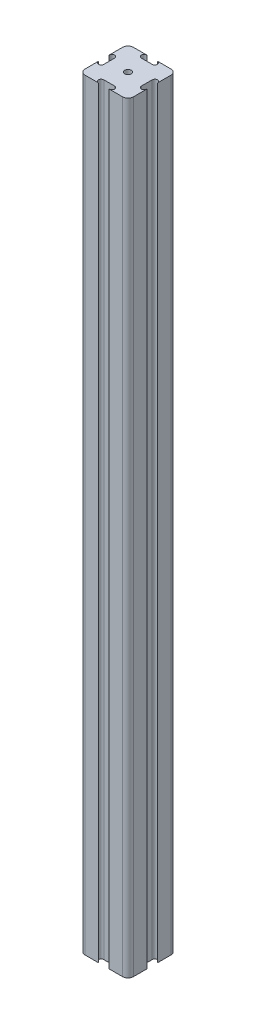
ISO-10303-21;
HEADER;
FILE_DESCRIPTION(('STEP AP214'),'2;1');
FILE_NAME('part.step','',(''),(''),'','','');
FILE_SCHEMA(('AUTOMOTIVE_DESIGN { 1 0 10303 214 1 1 1 1 }'));
ENDSEC;
DATA;
#1=APPLICATION_CONTEXT('core data for automotive mechanical design processes');
#2=APPLICATION_PROTOCOL_DEFINITION('international standard','automotive_design',2000,#1);
#3=PRODUCT_CONTEXT('',#1,'mechanical');
#4=PRODUCT('Part','Part','',(#3));
#5=PRODUCT_RELATED_PRODUCT_CATEGORY('part','',(#4));
#6=PRODUCT_DEFINITION_FORMATION('','',#4);
#7=PRODUCT_DEFINITION_CONTEXT('part definition',#1,'design');
#8=PRODUCT_DEFINITION('design','',#6,#7);
#9=PRODUCT_DEFINITION_SHAPE('','',#8);
#10=(LENGTH_UNIT() NAMED_UNIT(*) SI_UNIT(.MILLI.,.METRE.));
#11=(NAMED_UNIT(*) PLANE_ANGLE_UNIT() SI_UNIT($,.RADIAN.));
#12=(NAMED_UNIT(*) SI_UNIT($,.STERADIAN.) SOLID_ANGLE_UNIT());
#13=UNCERTAINTY_MEASURE_WITH_UNIT(LENGTH_MEASURE(1.E-05),#10,'distance_accuracy_value','');
#14=(GEOMETRIC_REPRESENTATION_CONTEXT(3) GLOBAL_UNCERTAINTY_ASSIGNED_CONTEXT((#13)) GLOBAL_UNIT_ASSIGNED_CONTEXT((#10,
#11,#12)) REPRESENTATION_CONTEXT('',''));
#15=CARTESIAN_POINT('',(0.,0.,0.));
#16=DIRECTION('',(0.,0.,1.));
#17=DIRECTION('',(1.,0.,0.));
#18=AXIS2_PLACEMENT_3D('',#15,#16,#17);
#19=CARTESIAN_POINT('',(-20.,710.,5.));
#20=DIRECTION('',(0.,-1.,0.));
#21=DIRECTION('',(0.,0.,-1.));
#22=AXIS2_PLACEMENT_3D('',#19,#20,#21);
#23=CYLINDRICAL_SURFACE('',#22,2.5);
#24=CARTESIAN_POINT('',(-20.,0.,5.));
#25=DIRECTION('',(0.,-1.,0.));
#26=DIRECTION('',(0.,0.,-1.));
#27=AXIS2_PLACEMENT_3D('',#24,#25,#26);
#28=CIRCLE('',#27,2.5);
#29=CARTESIAN_POINT('',(-17.5,0.,5.));
#30=VERTEX_POINT('',#29);
#31=CARTESIAN_POINT('',(-22.5,0.,5.));
#32=VERTEX_POINT('',#31);
#33=EDGE_CURVE('E225',#30,#32,#28,.T.);
#34=ORIENTED_EDGE('',*,*,#33,.T.);
#35=DIRECTION('',(0.,-1.,0.));
#36=VECTOR('',#35,1.);
#37=CARTESIAN_POINT('',(-22.5,710.,5.));
#38=LINE('',#37,#36);
#39=CARTESIAN_POINT('',(-22.5,710.,5.));
#40=VERTEX_POINT('',#39);
#41=EDGE_CURVE('E11',#40,#32,#38,.T.);
#42=ORIENTED_EDGE('',*,*,#41,.F.);
#43=CARTESIAN_POINT('',(-20.,710.,5.));
#44=DIRECTION('',(0.,-1.,0.));
#45=DIRECTION('',(0.,0.,-1.));
#46=AXIS2_PLACEMENT_3D('',#43,#44,#45);
#47=CIRCLE('',#46,2.5);
#48=CARTESIAN_POINT('',(-17.5,710.,5.));
#49=VERTEX_POINT('',#48);
#50=EDGE_CURVE('E290',#49,#40,#47,.T.);
#51=ORIENTED_EDGE('',*,*,#50,.F.);
#52=DIRECTION('',(0.,-1.,0.));
#53=VECTOR('',#52,1.);
#54=CARTESIAN_POINT('',(-17.5,710.,5.));
#55=LINE('',#54,#53);
#56=EDGE_CURVE('E221',#49,#30,#55,.T.);
#57=ORIENTED_EDGE('',*,*,#56,.T.);
#58=EDGE_LOOP('',(#34,#42,#51,#57));
#59=FACE_BOUND('',#58,.T.);
#60=ADVANCED_FACE('F33',(#59),#23,.F.);
#61=CARTESIAN_POINT('',(-22.5,710.,5.));
#62=DIRECTION('',(1.,0.,0.));
#63=DIRECTION('',(0.,0.,-1.));
#64=AXIS2_PLACEMENT_3D('',#61,#62,#63);
#65=PLANE('',#64);
#66=DIRECTION('',(0.,0.,1.));
#67=VECTOR('',#66,1.);
#68=CARTESIAN_POINT('',(-22.5,0.,5.));
#69=LINE('',#68,#67);
#70=CARTESIAN_POINT('',(-22.5,0.,17.4999999999999));
#71=VERTEX_POINT('',#70);
#72=EDGE_CURVE('E228',#32,#71,#69,.T.);
#73=ORIENTED_EDGE('',*,*,#72,.T.);
#74=DIRECTION('',(0.,-1.,0.));
#75=VECTOR('',#74,1.);
#76=CARTESIAN_POINT('',(-22.5,710.,17.4999999999999));
#77=LINE('',#76,#75);
#78=CARTESIAN_POINT('',(-22.5,710.,17.4999999999999));
#79=VERTEX_POINT('',#78);
#80=EDGE_CURVE('E41',#79,#71,#77,.T.);
#81=ORIENTED_EDGE('',*,*,#80,.F.);
#82=DIRECTION('',(0.,0.,1.));
#83=VECTOR('',#82,1.);
#84=CARTESIAN_POINT('',(-22.5,710.,5.));
#85=LINE('',#84,#83);
#86=EDGE_CURVE('E136',#40,#79,#85,.T.);
#87=ORIENTED_EDGE('',*,*,#86,.F.);
#88=ORIENTED_EDGE('',*,*,#41,.T.);
#89=EDGE_LOOP('',(#73,#81,#87,#88));
#90=FACE_BOUND('',#89,.T.);
#91=ADVANCED_FACE('F417',(#90),#65,.F.);
#92=CARTESIAN_POINT('',(-17.5,710.,17.5));
#93=DIRECTION('',(0.,-1.,0.));
#94=DIRECTION('',(0.,0.,-1.));
#95=AXIS2_PLACEMENT_3D('',#92,#93,#94);
#96=CYLINDRICAL_SURFACE('',#95,5.);
#97=CARTESIAN_POINT('',(-17.5,0.,17.5));
#98=DIRECTION('',(0.,1.,0.));
#99=DIRECTION('',(0.,0.,1.));
#100=AXIS2_PLACEMENT_3D('',#97,#98,#99);
#101=CIRCLE('',#100,5.);
#102=CARTESIAN_POINT('',(-17.5,0.,22.5));
#103=VERTEX_POINT('',#102);
#104=EDGE_CURVE('E231',#71,#103,#101,.T.);
#105=ORIENTED_EDGE('',*,*,#104,.T.);
#106=DIRECTION('',(0.,-1.,0.));
#107=VECTOR('',#106,1.);
#108=CARTESIAN_POINT('',(-17.5,710.,22.5));
#109=LINE('',#108,#107);
#110=CARTESIAN_POINT('',(-17.5,710.,22.5));
#111=VERTEX_POINT('',#110);
#112=EDGE_CURVE('E329',#111,#103,#109,.T.);
#113=ORIENTED_EDGE('',*,*,#112,.F.);
#114=CARTESIAN_POINT('',(-17.5,710.,17.5));
#115=DIRECTION('',(0.,1.,0.));
#116=DIRECTION('',(0.,0.,1.));
#117=AXIS2_PLACEMENT_3D('',#114,#115,#116);
#118=CIRCLE('',#117,5.);
#119=EDGE_CURVE('E336',#79,#111,#118,.T.);
#120=ORIENTED_EDGE('',*,*,#119,.F.);
#121=ORIENTED_EDGE('',*,*,#80,.T.);
#122=EDGE_LOOP('',(#105,#113,#120,#121));
#123=FACE_BOUND('',#122,.T.);
#124=ADVANCED_FACE('F334',(#123),#96,.T.);
#125=CARTESIAN_POINT('',(-4.99999999999998,710.,22.5));
#126=DIRECTION('',(0.,0.,1.));
#127=DIRECTION('',(1.,0.,0.));
#128=AXIS2_PLACEMENT_3D('',#125,#126,#127);
#129=PLANE('',#128);
#130=DIRECTION('',(-1.,0.,0.));
#131=VECTOR('',#130,1.);
#132=CARTESIAN_POINT('',(-4.99999999999998,0.,22.5));
#133=LINE('',#132,#131);
#134=CARTESIAN_POINT('',(-4.99999999999998,0.,22.5));
#135=VERTEX_POINT('',#134);
#136=EDGE_CURVE('E234',#135,#103,#133,.T.);
#137=ORIENTED_EDGE('',*,*,#136,.F.);
#138=DIRECTION('',(0.,-1.,0.));
#139=VECTOR('',#138,1.);
#140=CARTESIAN_POINT('',(-4.99999999999998,710.,22.5));
#141=LINE('',#140,#139);
#142=CARTESIAN_POINT('',(-4.99999999999998,710.,22.5));
#143=VERTEX_POINT('',#142);
#144=EDGE_CURVE('E327',#143,#135,#141,.T.);
#145=ORIENTED_EDGE('',*,*,#144,.F.);
#146=DIRECTION('',(-1.,0.,0.));
#147=VECTOR('',#146,1.);
#148=CARTESIAN_POINT('',(-4.99999999999998,710.,22.5));
#149=LINE('',#148,#147);
#150=EDGE_CURVE('E347',#143,#111,#149,.T.);
#151=ORIENTED_EDGE('',*,*,#150,.T.);
#152=ORIENTED_EDGE('',*,*,#112,.T.);
#153=EDGE_LOOP('',(#137,#145,#151,#152));
#154=FACE_BOUND('',#153,.T.);
#155=ADVANCED_FACE('F344',(#154),#129,.T.);
#156=CARTESIAN_POINT('',(-5.,710.,20.));
#157=DIRECTION('',(0.,-1.,0.));
#158=DIRECTION('',(0.,0.,-1.));
#159=AXIS2_PLACEMENT_3D('',#156,#157,#158);
#160=CYLINDRICAL_SURFACE('',#159,2.5);
#161=CARTESIAN_POINT('',(-5.,0.,20.));
#162=DIRECTION('',(0.,1.,0.));
#163=DIRECTION('',(0.,0.,1.));
#164=AXIS2_PLACEMENT_3D('',#161,#162,#163);
#165=CIRCLE('',#164,2.5);
#166=CARTESIAN_POINT('',(-4.99999999999998,0.,17.5));
#167=VERTEX_POINT('',#166);
#168=EDGE_CURVE('E237',#167,#135,#165,.T.);
#169=ORIENTED_EDGE('',*,*,#168,.F.);
#170=DIRECTION('',(0.,-1.,0.));
#171=VECTOR('',#170,1.);
#172=CARTESIAN_POINT('',(-4.99999999999998,710.,17.5));
#173=LINE('',#172,#171);
#174=CARTESIAN_POINT('',(-4.99999999999998,710.,17.5));
#175=VERTEX_POINT('',#174);
#176=EDGE_CURVE('E325',#175,#167,#173,.T.);
#177=ORIENTED_EDGE('',*,*,#176,.F.);
#178=CARTESIAN_POINT('',(-5.,710.,20.));
#179=DIRECTION('',(0.,1.,0.));
#180=DIRECTION('',(0.,0.,1.));
#181=AXIS2_PLACEMENT_3D('',#178,#179,#180);
#182=CIRCLE('',#181,2.5);
#183=EDGE_CURVE('E350',#175,#143,#182,.T.);
#184=ORIENTED_EDGE('',*,*,#183,.T.);
#185=ORIENTED_EDGE('',*,*,#144,.T.);
#186=EDGE_LOOP('',(#169,#177,#184,#185));
#187=FACE_BOUND('',#186,.T.);
#188=ADVANCED_FACE('F624',(#187),#160,.F.);
#189=CARTESIAN_POINT('',(-4.99999999999998,710.,17.5));
#190=DIRECTION('',(0.,0.,-1.));
#191=DIRECTION('',(-1.,0.,0.));
#192=AXIS2_PLACEMENT_3D('',#189,#190,#191);
#193=PLANE('',#192);
#194=DIRECTION('',(1.,0.,0.));
#195=VECTOR('',#194,1.);
#196=CARTESIAN_POINT('',(-4.99999999999998,0.,17.5));
#197=LINE('',#196,#195);
#198=CARTESIAN_POINT('',(5.00000000000002,0.,17.5));
#199=VERTEX_POINT('',#198);
#200=EDGE_CURVE('E240',#167,#199,#197,.T.);
#201=ORIENTED_EDGE('',*,*,#200,.T.);
#202=DIRECTION('',(0.,-1.,0.));
#203=VECTOR('',#202,1.);
#204=CARTESIAN_POINT('',(5.00000000000002,710.,17.5));
#205=LINE('',#204,#203);
#206=CARTESIAN_POINT('',(5.00000000000002,710.,17.5));
#207=VERTEX_POINT('',#206);
#208=EDGE_CURVE('E323',#207,#199,#205,.T.);
#209=ORIENTED_EDGE('',*,*,#208,.F.);
#210=DIRECTION('',(1.,0.,0.));
#211=VECTOR('',#210,1.);
#212=CARTESIAN_POINT('',(-4.99999999999998,710.,17.5));
#213=LINE('',#212,#211);
#214=EDGE_CURVE('E352',#175,#207,#213,.T.);
#215=ORIENTED_EDGE('',*,*,#214,.F.);
#216=ORIENTED_EDGE('',*,*,#176,.T.);
#217=EDGE_LOOP('',(#201,#209,#215,#216));
#218=FACE_BOUND('',#217,.T.);
#219=ADVANCED_FACE('F614',(#218),#193,.F.);
#220=CARTESIAN_POINT('',(4.99999999999996,710.,20.));
#221=DIRECTION('',(0.,-1.,0.));
#222=DIRECTION('',(0.,0.,-1.));
#223=AXIS2_PLACEMENT_3D('',#220,#221,#222);
#224=CYLINDRICAL_SURFACE('',#223,2.50000000000001);
#225=CARTESIAN_POINT('',(4.99999999999996,0.,20.));
#226=DIRECTION('',(0.,1.,0.));
#227=DIRECTION('',(0.,0.,1.));
#228=AXIS2_PLACEMENT_3D('',#225,#226,#227);
#229=CIRCLE('',#228,2.50000000000001);
#230=CARTESIAN_POINT('',(4.99999999999996,0.,22.5));
#231=VERTEX_POINT('',#230);
#232=EDGE_CURVE('E243',#231,#199,#229,.T.);
#233=ORIENTED_EDGE('',*,*,#232,.F.);
#234=DIRECTION('',(0.,-1.,0.));
#235=VECTOR('',#234,1.);
#236=CARTESIAN_POINT('',(4.99999999999996,710.,22.5));
#237=LINE('',#236,#235);
#238=CARTESIAN_POINT('',(4.99999999999996,710.,22.5));
#239=VERTEX_POINT('',#238);
#240=EDGE_CURVE('E321',#239,#231,#237,.T.);
#241=ORIENTED_EDGE('',*,*,#240,.F.);
#242=CARTESIAN_POINT('',(4.99999999999996,710.,20.));
#243=DIRECTION('',(0.,1.,0.));
#244=DIRECTION('',(0.,0.,1.));
#245=AXIS2_PLACEMENT_3D('',#242,#243,#244);
#246=CIRCLE('',#245,2.50000000000001);
#247=EDGE_CURVE('E358',#239,#207,#246,.T.);
#248=ORIENTED_EDGE('',*,*,#247,.T.);
#249=ORIENTED_EDGE('',*,*,#208,.T.);
#250=EDGE_LOOP('',(#233,#241,#248,#249));
#251=FACE_BOUND('',#250,.T.);
#252=ADVANCED_FACE('F604',(#251),#224,.F.);
#253=CARTESIAN_POINT('',(4.99999999999996,710.,22.5));
#254=DIRECTION('',(0.,0.,-1.));
#255=DIRECTION('',(-1.,0.,0.));
#256=AXIS2_PLACEMENT_3D('',#253,#254,#255);
#257=PLANE('',#256);
#258=DIRECTION('',(1.,0.,0.));
#259=VECTOR('',#258,1.);
#260=CARTESIAN_POINT('',(4.99999999999996,0.,22.5));
#261=LINE('',#260,#259);
#262=CARTESIAN_POINT('',(17.5,0.,22.5));
#263=VERTEX_POINT('',#262);
#264=EDGE_CURVE('E246',#231,#263,#261,.T.);
#265=ORIENTED_EDGE('',*,*,#264,.T.);
#266=DIRECTION('',(0.,-1.,0.));
#267=VECTOR('',#266,1.);
#268=CARTESIAN_POINT('',(17.5,710.,22.5));
#269=LINE('',#268,#267);
#270=CARTESIAN_POINT('',(17.5,710.,22.5));
#271=VERTEX_POINT('',#270);
#272=EDGE_CURVE('E318',#271,#263,#269,.T.);
#273=ORIENTED_EDGE('',*,*,#272,.F.);
#274=DIRECTION('',(1.,0.,0.));
#275=VECTOR('',#274,1.);
#276=CARTESIAN_POINT('',(4.99999999999996,710.,22.5));
#277=LINE('',#276,#275);
#278=EDGE_CURVE('E361',#239,#271,#277,.T.);
#279=ORIENTED_EDGE('',*,*,#278,.F.);
#280=ORIENTED_EDGE('',*,*,#240,.T.);
#281=EDGE_LOOP('',(#265,#273,#279,#280));
#282=FACE_BOUND('',#281,.T.);
#283=ADVANCED_FACE('F594',(#282),#257,.F.);
#284=CARTESIAN_POINT('',(17.5000000000006,710.,17.5));
#285=DIRECTION('',(0.,-1.,0.));
#286=DIRECTION('',(0.,0.,-1.));
#287=AXIS2_PLACEMENT_3D('',#284,#285,#286);
#288=CYLINDRICAL_SURFACE('',#287,5.);
#289=CARTESIAN_POINT('',(17.5000000000006,0.,17.5));
#290=DIRECTION('',(0.,1.,0.));
#291=DIRECTION('',(0.,0.,1.));
#292=AXIS2_PLACEMENT_3D('',#289,#290,#291);
#293=CIRCLE('',#292,5.);
#294=CARTESIAN_POINT('',(22.5,0.,17.5000025246919));
#295=VERTEX_POINT('',#294);
#296=EDGE_CURVE('E248',#263,#295,#293,.T.);
#297=ORIENTED_EDGE('',*,*,#296,.T.);
#298=DIRECTION('',(0.,-1.,0.));
#299=VECTOR('',#298,1.);
#300=CARTESIAN_POINT('',(22.5,710.,17.5000025246919));
#301=LINE('',#300,#299);
#302=CARTESIAN_POINT('',(22.5,710.,17.5000025246919));
#303=VERTEX_POINT('',#302);
#304=EDGE_CURVE('E316',#303,#295,#301,.T.);
#305=ORIENTED_EDGE('',*,*,#304,.F.);
#306=CARTESIAN_POINT('',(17.5000000000006,710.,17.5));
#307=DIRECTION('',(0.,1.,0.));
#308=DIRECTION('',(0.,0.,1.));
#309=AXIS2_PLACEMENT_3D('',#306,#307,#308);
#310=CIRCLE('',#309,5.);
#311=EDGE_CURVE('E363',#271,#303,#310,.T.);
#312=ORIENTED_EDGE('',*,*,#311,.F.);
#313=ORIENTED_EDGE('',*,*,#272,.T.);
#314=EDGE_LOOP('',(#297,#305,#312,#313));
#315=FACE_BOUND('',#314,.T.);
#316=ADVANCED_FACE('F584',(#315),#288,.T.);
#317=CARTESIAN_POINT('',(22.5,710.,5.00000252469196));
#318=DIRECTION('',(1.,0.,0.));
#319=DIRECTION('',(0.,0.,-1.));
#320=AXIS2_PLACEMENT_3D('',#317,#318,#319);
#321=PLANE('',#320);
#322=DIRECTION('',(0.,0.,1.));
#323=VECTOR('',#322,1.);
#324=CARTESIAN_POINT('',(22.5,0.,5.00000252469196));
#325=LINE('',#324,#323);
#326=CARTESIAN_POINT('',(22.5,0.,5.00000252469196));
#327=VERTEX_POINT('',#326);
#328=EDGE_CURVE('E251',#327,#295,#325,.T.);
#329=ORIENTED_EDGE('',*,*,#328,.F.);
#330=DIRECTION('',(0.,-1.,0.));
#331=VECTOR('',#330,1.);
#332=CARTESIAN_POINT('',(22.5,710.,5.00000252469196));
#333=LINE('',#332,#331);
#334=CARTESIAN_POINT('',(22.5,710.,5.00000252469196));
#335=VERTEX_POINT('',#334);
#336=EDGE_CURVE('E314',#335,#327,#333,.T.);
#337=ORIENTED_EDGE('',*,*,#336,.F.);
#338=DIRECTION('',(0.,0.,1.));
#339=VECTOR('',#338,1.);
#340=CARTESIAN_POINT('',(22.5,710.,5.00000252469196));
#341=LINE('',#340,#339);
#342=EDGE_CURVE('E365',#335,#303,#341,.T.);
#343=ORIENTED_EDGE('',*,*,#342,.T.);
#344=ORIENTED_EDGE('',*,*,#304,.T.);
#345=EDGE_LOOP('',(#329,#337,#343,#344));
#346=FACE_BOUND('',#345,.T.);
#347=ADVANCED_FACE('F574',(#346),#321,.T.);
#348=CARTESIAN_POINT('',(20.,710.,5.00000252469196));
#349=DIRECTION('',(0.,-1.,0.));
#350=DIRECTION('',(0.,0.,-1.));
#351=AXIS2_PLACEMENT_3D('',#348,#349,#350);
#352=CYLINDRICAL_SURFACE('',#351,2.5);
#353=CARTESIAN_POINT('',(20.,0.,5.00000252469196));
#354=DIRECTION('',(0.,-1.,0.));
#355=DIRECTION('',(0.,0.,-1.));
#356=AXIS2_PLACEMENT_3D('',#353,#354,#355);
#357=CIRCLE('',#356,2.5);
#358=CARTESIAN_POINT('',(17.5,0.,5.00000252469196));
#359=VERTEX_POINT('',#358);
#360=EDGE_CURVE('E254',#327,#359,#357,.T.);
#361=ORIENTED_EDGE('',*,*,#360,.T.);
#362=DIRECTION('',(0.,-1.,0.));
#363=VECTOR('',#362,1.);
#364=CARTESIAN_POINT('',(17.5,710.,5.00000252469196));
#365=LINE('',#364,#363);
#366=CARTESIAN_POINT('',(17.5,710.,5.00000252469196));
#367=VERTEX_POINT('',#366);
#368=EDGE_CURVE('E312',#367,#359,#365,.T.);
#369=ORIENTED_EDGE('',*,*,#368,.F.);
#370=CARTESIAN_POINT('',(20.,710.,5.00000252469196));
#371=DIRECTION('',(0.,-1.,0.));
#372=DIRECTION('',(0.,0.,-1.));
#373=AXIS2_PLACEMENT_3D('',#370,#371,#372);
#374=CIRCLE('',#373,2.5);
#375=EDGE_CURVE('E368',#335,#367,#374,.T.);
#376=ORIENTED_EDGE('',*,*,#375,.F.);
#377=ORIENTED_EDGE('',*,*,#336,.T.);
#378=EDGE_LOOP('',(#361,#369,#376,#377));
#379=FACE_BOUND('',#378,.T.);
#380=ADVANCED_FACE('F564',(#379),#352,.F.);
#381=CARTESIAN_POINT('',(17.5,710.,-4.99999747530804));
#382=DIRECTION('',(1.,0.,0.));
#383=DIRECTION('',(0.,0.,-1.));
#384=AXIS2_PLACEMENT_3D('',#381,#382,#383);
#385=PLANE('',#384);
#386=DIRECTION('',(0.,0.,1.));
#387=VECTOR('',#386,1.);
#388=CARTESIAN_POINT('',(17.5,0.,-4.99999747530804));
#389=LINE('',#388,#387);
#390=CARTESIAN_POINT('',(17.5,0.,-4.99999747530804));
#391=VERTEX_POINT('',#390);
#392=EDGE_CURVE('E257',#391,#359,#389,.T.);
#393=ORIENTED_EDGE('',*,*,#392,.F.);
#394=DIRECTION('',(0.,-1.,0.));
#395=VECTOR('',#394,1.);
#396=CARTESIAN_POINT('',(17.5,710.,-4.99999747530804));
#397=LINE('',#396,#395);
#398=CARTESIAN_POINT('',(17.5,710.,-4.99999747530804));
#399=VERTEX_POINT('',#398);
#400=EDGE_CURVE('E310',#399,#391,#397,.T.);
#401=ORIENTED_EDGE('',*,*,#400,.F.);
#402=DIRECTION('',(0.,0.,1.));
#403=VECTOR('',#402,1.);
#404=CARTESIAN_POINT('',(17.5,710.,-4.99999747530804));
#405=LINE('',#404,#403);
#406=EDGE_CURVE('E370',#399,#367,#405,.T.);
#407=ORIENTED_EDGE('',*,*,#406,.T.);
#408=ORIENTED_EDGE('',*,*,#368,.T.);
#409=EDGE_LOOP('',(#393,#401,#407,#408));
#410=FACE_BOUND('',#409,.T.);
#411=ADVANCED_FACE('F554',(#410),#385,.T.);
#412=CARTESIAN_POINT('',(20.,710.,-4.99999747530804));
#413=DIRECTION('',(0.,-1.,0.));
#414=DIRECTION('',(0.,0.,-1.));
#415=AXIS2_PLACEMENT_3D('',#412,#413,#414);
#416=CYLINDRICAL_SURFACE('',#415,2.5);
#417=CARTESIAN_POINT('',(20.,0.,-4.99999747530804));
#418=DIRECTION('',(0.,1.,0.));
#419=DIRECTION('',(0.,0.,1.));
#420=AXIS2_PLACEMENT_3D('',#417,#418,#419);
#421=CIRCLE('',#420,2.5);
#422=CARTESIAN_POINT('',(22.5,0.,-4.99999747530804));
#423=VERTEX_POINT('',#422);
#424=EDGE_CURVE('E260',#423,#391,#421,.T.);
#425=ORIENTED_EDGE('',*,*,#424,.F.);
#426=DIRECTION('',(0.,-1.,0.));
#427=VECTOR('',#426,1.);
#428=CARTESIAN_POINT('',(22.5,710.,-4.99999747530804));
#429=LINE('',#428,#427);
#430=CARTESIAN_POINT('',(22.5,710.,-4.99999747530804));
#431=VERTEX_POINT('',#430);
#432=EDGE_CURVE('E308',#431,#423,#429,.T.);
#433=ORIENTED_EDGE('',*,*,#432,.F.);
#434=CARTESIAN_POINT('',(20.,710.,-4.99999747530804));
#435=DIRECTION('',(0.,1.,0.));
#436=DIRECTION('',(0.,0.,1.));
#437=AXIS2_PLACEMENT_3D('',#434,#435,#436);
#438=CIRCLE('',#437,2.5);
#439=EDGE_CURVE('E373',#431,#399,#438,.T.);
#440=ORIENTED_EDGE('',*,*,#439,.T.);
#441=ORIENTED_EDGE('',*,*,#400,.T.);
#442=EDGE_LOOP('',(#425,#433,#440,#441));
#443=FACE_BOUND('',#442,.T.);
#444=ADVANCED_FACE('F544',(#443),#416,.F.);
#445=CARTESIAN_POINT('',(22.5,710.,-4.99999747530804));
#446=DIRECTION('',(-1.,0.,0.));
#447=DIRECTION('',(0.,0.,1.));
#448=AXIS2_PLACEMENT_3D('',#445,#446,#447);
#449=PLANE('',#448);
#450=DIRECTION('',(0.,0.,-1.));
#451=VECTOR('',#450,1.);
#452=CARTESIAN_POINT('',(22.5,0.,-4.99999747530804));
#453=LINE('',#452,#451);
#454=CARTESIAN_POINT('',(22.5,0.,-17.499997475308));
#455=VERTEX_POINT('',#454);
#456=EDGE_CURVE('E263',#423,#455,#453,.T.);
#457=ORIENTED_EDGE('',*,*,#456,.T.);
#458=DIRECTION('',(0.,-1.,0.));
#459=VECTOR('',#458,1.);
#460=CARTESIAN_POINT('',(22.5,710.,-17.499997475308));
#461=LINE('',#460,#459);
#462=CARTESIAN_POINT('',(22.5,710.,-17.499997475308));
#463=VERTEX_POINT('',#462);
#464=EDGE_CURVE('E306',#463,#455,#461,.T.);
#465=ORIENTED_EDGE('',*,*,#464,.F.);
#466=DIRECTION('',(0.,0.,-1.));
#467=VECTOR('',#466,1.);
#468=CARTESIAN_POINT('',(22.5,710.,-4.99999747530804));
#469=LINE('',#468,#467);
#470=EDGE_CURVE('E376',#431,#463,#469,.T.);
#471=ORIENTED_EDGE('',*,*,#470,.F.);
#472=ORIENTED_EDGE('',*,*,#432,.T.);
#473=EDGE_LOOP('',(#457,#465,#471,#472));
#474=FACE_BOUND('',#473,.T.);
#475=ADVANCED_FACE('F534',(#474),#449,.F.);
#476=CARTESIAN_POINT('',(17.5000000000006,710.,-17.5));
#477=DIRECTION('',(0.,-1.,0.));
#478=DIRECTION('',(0.,0.,-1.));
#479=AXIS2_PLACEMENT_3D('',#476,#477,#478);
#480=CYLINDRICAL_SURFACE('',#479,5.00000000000001);
#481=CARTESIAN_POINT('',(17.5000000000006,0.,-17.5));
#482=DIRECTION('',(0.,-1.,0.));
#483=DIRECTION('',(0.,0.,-1.));
#484=AXIS2_PLACEMENT_3D('',#481,#482,#483);
#485=CIRCLE('',#484,5.00000000000001);
#486=CARTESIAN_POINT('',(17.5,0.,-22.5));
#487=VERTEX_POINT('',#486);
#488=EDGE_CURVE('E266',#487,#455,#485,.T.);
#489=ORIENTED_EDGE('',*,*,#488,.F.);
#490=DIRECTION('',(0.,-1.,0.));
#491=VECTOR('',#490,1.);
#492=CARTESIAN_POINT('',(17.5,710.,-22.5));
#493=LINE('',#492,#491);
#494=CARTESIAN_POINT('',(17.5,710.,-22.5));
#495=VERTEX_POINT('',#494);
#496=EDGE_CURVE('E304',#495,#487,#493,.T.);
#497=ORIENTED_EDGE('',*,*,#496,.F.);
#498=CARTESIAN_POINT('',(17.5000000000006,710.,-17.5));
#499=DIRECTION('',(0.,-1.,0.));
#500=DIRECTION('',(0.,0.,-1.));
#501=AXIS2_PLACEMENT_3D('',#498,#499,#500);
#502=CIRCLE('',#501,5.00000000000001);
#503=EDGE_CURVE('E378',#495,#463,#502,.T.);
#504=ORIENTED_EDGE('',*,*,#503,.T.);
#505=ORIENTED_EDGE('',*,*,#464,.T.);
#506=EDGE_LOOP('',(#489,#497,#504,#505));
#507=FACE_BOUND('',#506,.T.);
#508=ADVANCED_FACE('F524',(#507),#480,.T.);
#509=CARTESIAN_POINT('',(5.00000000000003,710.,-22.5));
#510=DIRECTION('',(0.,0.,-1.));
#511=DIRECTION('',(-1.,0.,0.));
#512=AXIS2_PLACEMENT_3D('',#509,#510,#511);
#513=PLANE('',#512);
#514=DIRECTION('',(1.,0.,0.));
#515=VECTOR('',#514,1.);
#516=CARTESIAN_POINT('',(5.00000000000003,0.,-22.5));
#517=LINE('',#516,#515);
#518=CARTESIAN_POINT('',(5.00000000000003,0.,-22.5));
#519=VERTEX_POINT('',#518);
#520=EDGE_CURVE('E269',#519,#487,#517,.T.);
#521=ORIENTED_EDGE('',*,*,#520,.F.);
#522=DIRECTION('',(0.,-1.,0.));
#523=VECTOR('',#522,1.);
#524=CARTESIAN_POINT('',(5.00000000000003,710.,-22.5));
#525=LINE('',#524,#523);
#526=CARTESIAN_POINT('',(5.00000000000003,710.,-22.5));
#527=VERTEX_POINT('',#526);
#528=EDGE_CURVE('E302',#527,#519,#525,.T.);
#529=ORIENTED_EDGE('',*,*,#528,.F.);
#530=DIRECTION('',(1.,0.,0.));
#531=VECTOR('',#530,1.);
#532=CARTESIAN_POINT('',(5.00000000000003,710.,-22.5));
#533=LINE('',#532,#531);
#534=EDGE_CURVE('E381',#527,#495,#533,.T.);
#535=ORIENTED_EDGE('',*,*,#534,.T.);
#536=ORIENTED_EDGE('',*,*,#496,.T.);
#537=EDGE_LOOP('',(#521,#529,#535,#536));
#538=FACE_BOUND('',#537,.T.);
#539=ADVANCED_FACE('F514',(#538),#513,.T.);
#540=CARTESIAN_POINT('',(5.00000000000003,710.,-20.));
#541=DIRECTION('',(0.,-1.,0.));
#542=DIRECTION('',(0.,0.,-1.));
#543=AXIS2_PLACEMENT_3D('',#540,#541,#542);
#544=CYLINDRICAL_SURFACE('',#543,2.50000000000001);
#545=CARTESIAN_POINT('',(5.00000000000003,0.,-20.));
#546=DIRECTION('',(0.,1.,0.));
#547=DIRECTION('',(0.,0.,1.));
#548=AXIS2_PLACEMENT_3D('',#545,#546,#547);
#549=CIRCLE('',#548,2.50000000000001);
#550=CARTESIAN_POINT('',(5.00000000000001,0.,-17.5));
#551=VERTEX_POINT('',#550);
#552=EDGE_CURVE('E272',#551,#519,#549,.T.);
#553=ORIENTED_EDGE('',*,*,#552,.F.);
#554=DIRECTION('',(0.,-1.,0.));
#555=VECTOR('',#554,1.);
#556=CARTESIAN_POINT('',(5.00000000000001,710.,-17.5));
#557=LINE('',#556,#555);
#558=CARTESIAN_POINT('',(5.00000000000001,710.,-17.5));
#559=VERTEX_POINT('',#558);
#560=EDGE_CURVE('E300',#559,#551,#557,.T.);
#561=ORIENTED_EDGE('',*,*,#560,.F.);
#562=CARTESIAN_POINT('',(5.00000000000003,710.,-20.));
#563=DIRECTION('',(0.,1.,0.));
#564=DIRECTION('',(0.,0.,1.));
#565=AXIS2_PLACEMENT_3D('',#562,#563,#564);
#566=CIRCLE('',#565,2.50000000000001);
#567=EDGE_CURVE('E384',#559,#527,#566,.T.);
#568=ORIENTED_EDGE('',*,*,#567,.T.);
#569=ORIENTED_EDGE('',*,*,#528,.T.);
#570=EDGE_LOOP('',(#553,#561,#568,#569));
#571=FACE_BOUND('',#570,.T.);
#572=ADVANCED_FACE('F504',(#571),#544,.F.);
#573=CARTESIAN_POINT('',(-5.,710.,-17.5));
#574=DIRECTION('',(0.,0.,-1.));
#575=DIRECTION('',(-1.,0.,0.));
#576=AXIS2_PLACEMENT_3D('',#573,#574,#575);
#577=PLANE('',#576);
#578=DIRECTION('',(1.,0.,0.));
#579=VECTOR('',#578,1.);
#580=CARTESIAN_POINT('',(-5.,0.,-17.5));
#581=LINE('',#580,#579);
#582=CARTESIAN_POINT('',(-5.,0.,-17.5));
#583=VERTEX_POINT('',#582);
#584=EDGE_CURVE('E275',#583,#551,#581,.T.);
#585=ORIENTED_EDGE('',*,*,#584,.F.);
#586=DIRECTION('',(0.,-1.,0.));
#587=VECTOR('',#586,1.);
#588=CARTESIAN_POINT('',(-5.,710.,-17.5));
#589=LINE('',#588,#587);
#590=CARTESIAN_POINT('',(-5.,710.,-17.5));
#591=VERTEX_POINT('',#590);
#592=EDGE_CURVE('E298',#591,#583,#589,.T.);
#593=ORIENTED_EDGE('',*,*,#592,.F.);
#594=DIRECTION('',(1.,0.,0.));
#595=VECTOR('',#594,1.);
#596=CARTESIAN_POINT('',(-5.,710.,-17.5));
#597=LINE('',#596,#595);
#598=EDGE_CURVE('E387',#591,#559,#597,.T.);
#599=ORIENTED_EDGE('',*,*,#598,.T.);
#600=ORIENTED_EDGE('',*,*,#560,.T.);
#601=EDGE_LOOP('',(#585,#593,#599,#600));
#602=FACE_BOUND('',#601,.T.);
#603=ADVANCED_FACE('F495',(#602),#577,.T.);
#604=CARTESIAN_POINT('',(-5.00000000000003,710.,-20.));
#605=DIRECTION('',(0.,-1.,0.));
#606=DIRECTION('',(0.,0.,-1.));
#607=AXIS2_PLACEMENT_3D('',#604,#605,#606);
#608=CYLINDRICAL_SURFACE('',#607,2.5);
#609=CARTESIAN_POINT('',(-5.00000000000003,0.,-20.));
#610=DIRECTION('',(0.,1.,0.));
#611=DIRECTION('',(0.,0.,1.));
#612=AXIS2_PLACEMENT_3D('',#609,#610,#611);
#613=CIRCLE('',#612,2.5);
#614=CARTESIAN_POINT('',(-5.00000000000003,0.,-22.5));
#615=VERTEX_POINT('',#614);
#616=EDGE_CURVE('E278',#615,#583,#613,.T.);
#617=ORIENTED_EDGE('',*,*,#616,.F.);
#618=DIRECTION('',(0.,-1.,0.));
#619=VECTOR('',#618,1.);
#620=CARTESIAN_POINT('',(-5.00000000000003,710.,-22.5));
#621=LINE('',#620,#619);
#622=CARTESIAN_POINT('',(-5.00000000000003,710.,-22.5));
#623=VERTEX_POINT('',#622);
#624=EDGE_CURVE('E296',#623,#615,#621,.T.);
#625=ORIENTED_EDGE('',*,*,#624,.F.);
#626=CARTESIAN_POINT('',(-5.00000000000003,710.,-20.));
#627=DIRECTION('',(0.,1.,0.));
#628=DIRECTION('',(0.,0.,1.));
#629=AXIS2_PLACEMENT_3D('',#626,#627,#628);
#630=CIRCLE('',#629,2.5);
#631=EDGE_CURVE('E390',#623,#591,#630,.T.);
#632=ORIENTED_EDGE('',*,*,#631,.T.);
#633=ORIENTED_EDGE('',*,*,#592,.T.);
#634=EDGE_LOOP('',(#617,#625,#632,#633));
#635=FACE_BOUND('',#634,.T.);
#636=ADVANCED_FACE('F403',(#635),#608,.F.);
#637=CARTESIAN_POINT('',(-17.5,710.,-22.5));
#638=DIRECTION('',(0.,0.,-1.));
#639=DIRECTION('',(-1.,0.,0.));
#640=AXIS2_PLACEMENT_3D('',#637,#638,#639);
#641=PLANE('',#640);
#642=DIRECTION('',(1.,0.,0.));
#643=VECTOR('',#642,1.);
#644=CARTESIAN_POINT('',(-17.5,0.,-22.5));
#645=LINE('',#644,#643);
#646=CARTESIAN_POINT('',(-17.5,0.,-22.5));
#647=VERTEX_POINT('',#646);
#648=EDGE_CURVE('E281',#647,#615,#645,.T.);
#649=ORIENTED_EDGE('',*,*,#648,.F.);
#650=DIRECTION('',(0.,-1.,0.));
#651=VECTOR('',#650,1.);
#652=CARTESIAN_POINT('',(-17.5,710.,-22.5));
#653=LINE('',#652,#651);
#654=CARTESIAN_POINT('',(-17.5,710.,-22.5));
#655=VERTEX_POINT('',#654);
#656=EDGE_CURVE('E294',#655,#647,#653,.T.);
#657=ORIENTED_EDGE('',*,*,#656,.F.);
#658=DIRECTION('',(1.,0.,0.));
#659=VECTOR('',#658,1.);
#660=CARTESIAN_POINT('',(-17.5,710.,-22.5));
#661=LINE('',#660,#659);
#662=EDGE_CURVE('E393',#655,#623,#661,.T.);
#663=ORIENTED_EDGE('',*,*,#662,.T.);
#664=ORIENTED_EDGE('',*,*,#624,.T.);
#665=EDGE_LOOP('',(#649,#657,#663,#664));
#666=FACE_BOUND('',#665,.T.);
#667=ADVANCED_FACE('F397',(#666),#641,.T.);
#668=CARTESIAN_POINT('',(-17.5,710.,-17.5));
#669=DIRECTION('',(0.,-1.,0.));
#670=DIRECTION('',(0.,0.,-1.));
#671=AXIS2_PLACEMENT_3D('',#668,#669,#670);
#672=CYLINDRICAL_SURFACE('',#671,5.00000000000001);
#673=CARTESIAN_POINT('',(-17.5,0.,-17.5));
#674=DIRECTION('',(0.,1.,0.));
#675=DIRECTION('',(0.,0.,1.));
#676=AXIS2_PLACEMENT_3D('',#673,#674,#675);
#677=CIRCLE('',#676,5.00000000000001);
#678=CARTESIAN_POINT('',(-22.5,0.,-17.5));
#679=VERTEX_POINT('',#678);
#680=EDGE_CURVE('E284',#647,#679,#677,.T.);
#681=ORIENTED_EDGE('',*,*,#680,.T.);
#682=DIRECTION('',(0.,-1.,0.));
#683=VECTOR('',#682,1.);
#684=CARTESIAN_POINT('',(-22.5,710.,-17.5));
#685=LINE('',#684,#683);
#686=CARTESIAN_POINT('',(-22.5,710.,-17.5));
#687=VERTEX_POINT('',#686);
#688=EDGE_CURVE('E217',#687,#679,#685,.T.);
#689=ORIENTED_EDGE('',*,*,#688,.F.);
#690=CARTESIAN_POINT('',(-17.5,710.,-17.5));
#691=DIRECTION('',(0.,1.,0.));
#692=DIRECTION('',(0.,0.,1.));
#693=AXIS2_PLACEMENT_3D('',#690,#691,#692);
#694=CIRCLE('',#693,5.00000000000001);
#695=EDGE_CURVE('E204',#655,#687,#694,.T.);
#696=ORIENTED_EDGE('',*,*,#695,.F.);
#697=ORIENTED_EDGE('',*,*,#656,.T.);
#698=EDGE_LOOP('',(#681,#689,#696,#697));
#699=FACE_BOUND('',#698,.T.);
#700=ADVANCED_FACE('F407',(#699),#672,.T.);
#701=CARTESIAN_POINT('',(-22.5,710.,-17.5));
#702=DIRECTION('',(1.,0.,0.));
#703=DIRECTION('',(0.,0.,-1.));
#704=AXIS2_PLACEMENT_3D('',#701,#702,#703);
#705=PLANE('',#704);
#706=DIRECTION('',(0.,0.,1.));
#707=VECTOR('',#706,1.);
#708=CARTESIAN_POINT('',(-22.5,0.,-17.5));
#709=LINE('',#708,#707);
#710=CARTESIAN_POINT('',(-22.5,0.,-5.));
#711=VERTEX_POINT('',#710);
#712=EDGE_CURVE('E213',#679,#711,#709,.T.);
#713=ORIENTED_EDGE('',*,*,#712,.T.);
#714=DIRECTION('',(0.,-1.,0.));
#715=VECTOR('',#714,1.);
#716=CARTESIAN_POINT('',(-22.5,710.,-5.));
#717=LINE('',#716,#715);
#718=CARTESIAN_POINT('',(-22.5,710.,-5.));
#719=VERTEX_POINT('',#718);
#720=EDGE_CURVE('E210',#719,#711,#717,.T.);
#721=ORIENTED_EDGE('',*,*,#720,.F.);
#722=DIRECTION('',(0.,0.,1.));
#723=VECTOR('',#722,1.);
#724=CARTESIAN_POINT('',(-22.5,710.,-17.5));
#725=LINE('',#724,#723);
#726=EDGE_CURVE('E197',#687,#719,#725,.T.);
#727=ORIENTED_EDGE('',*,*,#726,.F.);
#728=ORIENTED_EDGE('',*,*,#688,.T.);
#729=EDGE_LOOP('',(#713,#721,#727,#728));
#730=FACE_BOUND('',#729,.T.);
#731=ADVANCED_FACE('F211',(#730),#705,.F.);
#732=CARTESIAN_POINT('',(-20.,710.,-5.));
#733=DIRECTION('',(0.,-1.,0.));
#734=DIRECTION('',(0.,0.,-1.));
#735=AXIS2_PLACEMENT_3D('',#732,#733,#734);
#736=CYLINDRICAL_SURFACE('',#735,2.5);
#737=CARTESIAN_POINT('',(-20.,0.,-5.));
#738=DIRECTION('',(0.,1.,0.));
#739=DIRECTION('',(0.,0.,1.));
#740=AXIS2_PLACEMENT_3D('',#737,#738,#739);
#741=CIRCLE('',#740,2.5);
#742=CARTESIAN_POINT('',(-17.5,0.,-5.));
#743=VERTEX_POINT('',#742);
#744=EDGE_CURVE('E287',#743,#711,#741,.T.);
#745=ORIENTED_EDGE('',*,*,#744,.F.);
#746=DIRECTION('',(0.,-1.,0.));
#747=VECTOR('',#746,1.);
#748=CARTESIAN_POINT('',(-17.5,710.,-5.));
#749=LINE('',#748,#747);
#750=CARTESIAN_POINT('',(-17.5,710.,-5.));
#751=VERTEX_POINT('',#750);
#752=EDGE_CURVE('E125',#751,#743,#749,.T.);
#753=ORIENTED_EDGE('',*,*,#752,.F.);
#754=CARTESIAN_POINT('',(-20.,710.,-5.));
#755=DIRECTION('',(0.,1.,0.));
#756=DIRECTION('',(0.,0.,1.));
#757=AXIS2_PLACEMENT_3D('',#754,#755,#756);
#758=CIRCLE('',#757,2.5);
#759=EDGE_CURVE('E201',#751,#719,#758,.T.);
#760=ORIENTED_EDGE('',*,*,#759,.T.);
#761=ORIENTED_EDGE('',*,*,#720,.T.);
#762=EDGE_LOOP('',(#745,#753,#760,#761));
#763=FACE_BOUND('',#762,.T.);
#764=ADVANCED_FACE('F219',(#763),#736,.F.);
#765=CARTESIAN_POINT('',(-17.5,710.,-5.));
#766=DIRECTION('',(1.,0.,0.));
#767=DIRECTION('',(0.,0.,-1.));
#768=AXIS2_PLACEMENT_3D('',#765,#766,#767);
#769=PLANE('',#768);
#770=DIRECTION('',(0.,0.,1.));
#771=VECTOR('',#770,1.);
#772=CARTESIAN_POINT('',(-17.5,0.,-5.));
#773=LINE('',#772,#771);
#774=EDGE_CURVE('E128',#743,#30,#773,.T.);
#775=ORIENTED_EDGE('',*,*,#774,.T.);
#776=ORIENTED_EDGE('',*,*,#56,.F.);
#777=DIRECTION('',(0.,0.,1.));
#778=VECTOR('',#777,1.);
#779=CARTESIAN_POINT('',(-17.5,710.,-5.));
#780=LINE('',#779,#778);
#781=EDGE_CURVE('E49',#751,#49,#780,.T.);
#782=ORIENTED_EDGE('',*,*,#781,.F.);
#783=ORIENTED_EDGE('',*,*,#752,.T.);
#784=EDGE_LOOP('',(#775,#776,#782,#783));
#785=FACE_BOUND('',#784,.T.);
#786=ADVANCED_FACE('F424',(#785),#769,.F.);
#787=CARTESIAN_POINT('',(-20.,710.,5.));
#788=DIRECTION('',(0.,-1.,0.));
#789=DIRECTION('',(0.,0.,-1.));
#790=AXIS2_PLACEMENT_3D('',#787,#788,#789);
#791=PLANE('',#790);
#792=CARTESIAN_POINT('',(0.,710.,0.));
#793=DIRECTION('',(0.,-1.,0.));
#794=DIRECTION('',(0.,0.,-1.));
#795=AXIS2_PLACEMENT_3D('',#792,#793,#794);
#796=CIRCLE('',#795,3.);
#797=CARTESIAN_POINT('',(0.,710.,-3.));
#798=VERTEX_POINT('',#797);
#799=EDGE_CURVE('E229',#798,#798,#796,.T.);
#800=ORIENTED_EDGE('',*,*,#799,.T.);
#801=EDGE_LOOP('',(#800));
#802=FACE_BOUND('',#801,.T.);
#803=ORIENTED_EDGE('',*,*,#50,.T.);
#804=ORIENTED_EDGE('',*,*,#86,.T.);
#805=ORIENTED_EDGE('',*,*,#119,.T.);
#806=ORIENTED_EDGE('',*,*,#150,.F.);
#807=ORIENTED_EDGE('',*,*,#183,.F.);
#808=ORIENTED_EDGE('',*,*,#214,.T.);
#809=ORIENTED_EDGE('',*,*,#247,.F.);
#810=ORIENTED_EDGE('',*,*,#278,.T.);
#811=ORIENTED_EDGE('',*,*,#311,.T.);
#812=ORIENTED_EDGE('',*,*,#342,.F.);
#813=ORIENTED_EDGE('',*,*,#375,.T.);
#814=ORIENTED_EDGE('',*,*,#406,.F.);
#815=ORIENTED_EDGE('',*,*,#439,.F.);
#816=ORIENTED_EDGE('',*,*,#470,.T.);
#817=ORIENTED_EDGE('',*,*,#503,.F.);
#818=ORIENTED_EDGE('',*,*,#534,.F.);
#819=ORIENTED_EDGE('',*,*,#567,.F.);
#820=ORIENTED_EDGE('',*,*,#598,.F.);
#821=ORIENTED_EDGE('',*,*,#631,.F.);
#822=ORIENTED_EDGE('',*,*,#662,.F.);
#823=ORIENTED_EDGE('',*,*,#695,.T.);
#824=ORIENTED_EDGE('',*,*,#726,.T.);
#825=ORIENTED_EDGE('',*,*,#759,.F.);
#826=ORIENTED_EDGE('',*,*,#781,.T.);
#827=EDGE_LOOP('',(#803,#804,#805,#806,#807,#808,#809,#810,#811,#812,#813,#814,#815,#816,#817,
#818,#819,#820,#821,#822,#823,#824,#825,#826));
#828=FACE_BOUND('',#827,.T.);
#829=ADVANCED_FACE('F199',(#802,#828),#791,.F.);
#830=CARTESIAN_POINT('',(-20.,0.,5.));
#831=DIRECTION('',(0.,-1.,0.));
#832=DIRECTION('',(0.,0.,-1.));
#833=AXIS2_PLACEMENT_3D('',#830,#831,#832);
#834=PLANE('',#833);
#835=CARTESIAN_POINT('',(0.,0.,0.));
#836=DIRECTION('',(0.,-1.,0.));
#837=DIRECTION('',(0.,0.,-1.));
#838=AXIS2_PLACEMENT_3D('',#835,#836,#837);
#839=CIRCLE('',#838,3.);
#840=CARTESIAN_POINT('',(0.,0.,-3.));
#841=VERTEX_POINT('',#840);
#842=EDGE_CURVE('E448',#841,#841,#839,.T.);
#843=ORIENTED_EDGE('',*,*,#842,.F.);
#844=EDGE_LOOP('',(#843));
#845=FACE_BOUND('',#844,.T.);
#846=ORIENTED_EDGE('',*,*,#33,.F.);
#847=ORIENTED_EDGE('',*,*,#774,.F.);
#848=ORIENTED_EDGE('',*,*,#744,.T.);
#849=ORIENTED_EDGE('',*,*,#712,.F.);
#850=ORIENTED_EDGE('',*,*,#680,.F.);
#851=ORIENTED_EDGE('',*,*,#648,.T.);
#852=ORIENTED_EDGE('',*,*,#616,.T.);
#853=ORIENTED_EDGE('',*,*,#584,.T.);
#854=ORIENTED_EDGE('',*,*,#552,.T.);
#855=ORIENTED_EDGE('',*,*,#520,.T.);
#856=ORIENTED_EDGE('',*,*,#488,.T.);
#857=ORIENTED_EDGE('',*,*,#456,.F.);
#858=ORIENTED_EDGE('',*,*,#424,.T.);
#859=ORIENTED_EDGE('',*,*,#392,.T.);
#860=ORIENTED_EDGE('',*,*,#360,.F.);
#861=ORIENTED_EDGE('',*,*,#328,.T.);
#862=ORIENTED_EDGE('',*,*,#296,.F.);
#863=ORIENTED_EDGE('',*,*,#264,.F.);
#864=ORIENTED_EDGE('',*,*,#232,.T.);
#865=ORIENTED_EDGE('',*,*,#200,.F.);
#866=ORIENTED_EDGE('',*,*,#168,.T.);
#867=ORIENTED_EDGE('',*,*,#136,.T.);
#868=ORIENTED_EDGE('',*,*,#104,.F.);
#869=ORIENTED_EDGE('',*,*,#72,.F.);
#870=EDGE_LOOP('',(#846,#847,#848,#849,#850,#851,#852,#853,#854,#855,#856,#857,#858,#859,#860,
#861,#862,#863,#864,#865,#866,#867,#868,#869));
#871=FACE_BOUND('',#870,.T.);
#872=ADVANCED_FACE('F339',(#845,#871),#834,.T.);
#873=CARTESIAN_POINT('',(0.,710.,0.));
#874=DIRECTION('',(0.,-1.,0.));
#875=DIRECTION('',(0.,0.,-1.));
#876=AXIS2_PLACEMENT_3D('',#873,#874,#875);
#877=CYLINDRICAL_SURFACE('',#876,3.);
#878=ORIENTED_EDGE('',*,*,#799,.F.);
#879=EDGE_LOOP('',(#878));
#880=FACE_BOUND('',#879,.T.);
#881=ORIENTED_EDGE('',*,*,#842,.T.);
#882=EDGE_LOOP('',(#881));
#883=FACE_BOUND('',#882,.T.);
#884=ADVANCED_FACE('F436',(#880,#883),#877,.F.);
#885=CLOSED_SHELL('',(#60,#91,#124,#155,#188,#219,#252,#283,#316,#347,#380,#411,#444,#475,#508,
#539,#572,#603,#636,#667,#700,#731,#764,#786,#829,#872,#884));
#886=MANIFOLD_SOLID_BREP('B2',#885);
#887=ADVANCED_BREP_SHAPE_REPRESENTATION('',(#18,#886),#14);
#888=SHAPE_DEFINITION_REPRESENTATION(#9,#887);
ENDSEC;
END-ISO-10303-21;
